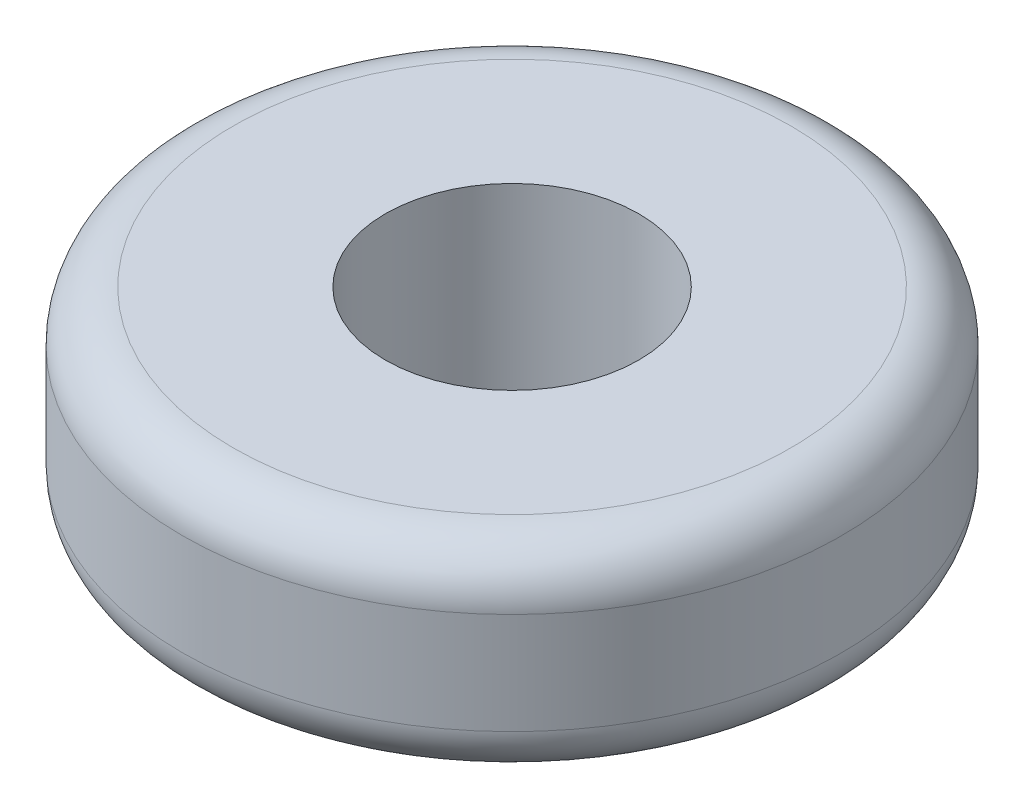
ISO-10303-21;
HEADER;
FILE_DESCRIPTION(('STEP AP214'),'2;1');
FILE_NAME('part.step','',(''),(''),'','','');
FILE_SCHEMA(('AUTOMOTIVE_DESIGN { 1 0 10303 214 1 1 1 1 }'));
ENDSEC;
DATA;
#1=APPLICATION_CONTEXT('core data for automotive mechanical design processes');
#2=APPLICATION_PROTOCOL_DEFINITION('international standard','automotive_design',2000,#1);
#3=PRODUCT_CONTEXT('',#1,'mechanical');
#4=PRODUCT('Part','Part','',(#3));
#5=PRODUCT_RELATED_PRODUCT_CATEGORY('part','',(#4));
#6=PRODUCT_DEFINITION_FORMATION('','',#4);
#7=PRODUCT_DEFINITION_CONTEXT('part definition',#1,'design');
#8=PRODUCT_DEFINITION('design','',#6,#7);
#9=PRODUCT_DEFINITION_SHAPE('','',#8);
#10=(LENGTH_UNIT() NAMED_UNIT(*) SI_UNIT(.MILLI.,.METRE.));
#11=(NAMED_UNIT(*) PLANE_ANGLE_UNIT() SI_UNIT($,.RADIAN.));
#12=(NAMED_UNIT(*) SI_UNIT($,.STERADIAN.) SOLID_ANGLE_UNIT());
#13=UNCERTAINTY_MEASURE_WITH_UNIT(LENGTH_MEASURE(1.E-05),#10,'distance_accuracy_value','');
#14=(GEOMETRIC_REPRESENTATION_CONTEXT(3) GLOBAL_UNCERTAINTY_ASSIGNED_CONTEXT((#13)) GLOBAL_UNIT_ASSIGNED_CONTEXT((#10,
#11,#12)) REPRESENTATION_CONTEXT('',''));
#15=CARTESIAN_POINT('',(0.,0.,0.));
#16=DIRECTION('',(0.,0.,1.));
#17=DIRECTION('',(1.,0.,0.));
#18=AXIS2_PLACEMENT_3D('',#15,#16,#17);
#19=CARTESIAN_POINT('',(0.,8.,0.));
#20=DIRECTION('',(0.,1.,0.));
#21=DIRECTION('',(0.,0.,1.));
#22=AXIS2_PLACEMENT_3D('',#19,#20,#21);
#23=PLANE('',#22);
#24=CARTESIAN_POINT('',(0.,8.,0.));
#25=DIRECTION('',(0.,1.,0.));
#26=DIRECTION('',(0.,0.,1.));
#27=AXIS2_PLACEMENT_3D('',#24,#25,#26);
#28=CIRCLE('',#27,11.);
#29=CARTESIAN_POINT('',(0.,8.,11.));
#30=VERTEX_POINT('',#29);
#31=EDGE_CURVE('E10',#30,#30,#28,.T.);
#32=ORIENTED_EDGE('',*,*,#31,.T.);
#33=EDGE_LOOP('',(#32));
#34=FACE_BOUND('',#33,.T.);
#35=CARTESIAN_POINT('',(0.,8.,0.));
#36=DIRECTION('',(0.,1.,0.));
#37=DIRECTION('',(0.,0.,1.));
#38=AXIS2_PLACEMENT_3D('',#35,#36,#37);
#39=CIRCLE('',#38,5.);
#40=CARTESIAN_POINT('',(0.,8.,5.));
#41=VERTEX_POINT('',#40);
#42=EDGE_CURVE('E55',#41,#41,#39,.T.);
#43=ORIENTED_EDGE('',*,*,#42,.F.);
#44=EDGE_LOOP('',(#43));
#45=FACE_BOUND('',#44,.T.);
#46=ADVANCED_FACE('F35',(#34,#45),#23,.T.);
#47=CARTESIAN_POINT('',(0.,0.,0.));
#48=DIRECTION('',(0.,1.,0.));
#49=DIRECTION('',(0.,0.,1.));
#50=AXIS2_PLACEMENT_3D('',#47,#48,#49);
#51=PLANE('',#50);
#52=CARTESIAN_POINT('',(0.,0.,0.));
#53=DIRECTION('',(0.,1.,0.));
#54=DIRECTION('',(0.,0.,1.));
#55=AXIS2_PLACEMENT_3D('',#52,#53,#54);
#56=CIRCLE('',#55,11.);
#57=CARTESIAN_POINT('',(0.,0.,11.));
#58=VERTEX_POINT('',#57);
#59=EDGE_CURVE('E42',#58,#58,#56,.F.);
#60=ORIENTED_EDGE('',*,*,#59,.T.);
#61=EDGE_LOOP('',(#60));
#62=FACE_BOUND('',#61,.T.);
#63=CARTESIAN_POINT('',(0.,0.,0.));
#64=DIRECTION('',(0.,1.,0.));
#65=DIRECTION('',(0.,0.,1.));
#66=AXIS2_PLACEMENT_3D('',#63,#64,#65);
#67=CIRCLE('',#66,5.);
#68=CARTESIAN_POINT('',(0.,0.,5.));
#69=VERTEX_POINT('',#68);
#70=EDGE_CURVE('E56',#69,#69,#67,.T.);
#71=ORIENTED_EDGE('',*,*,#70,.T.);
#72=EDGE_LOOP('',(#71));
#73=FACE_BOUND('',#72,.T.);
#74=ADVANCED_FACE('F66',(#62,#73),#51,.F.);
#75=CARTESIAN_POINT('',(0.,8.,0.));
#76=DIRECTION('',(0.,-1.,0.));
#77=DIRECTION('',(0.,0.,-1.));
#78=AXIS2_PLACEMENT_3D('',#75,#76,#77);
#79=CYLINDRICAL_SURFACE('',#78,13.);
#80=CARTESIAN_POINT('',(0.,2.,0.));
#81=DIRECTION('',(0.,1.,0.));
#82=DIRECTION('',(0.,0.,1.));
#83=AXIS2_PLACEMENT_3D('',#80,#81,#82);
#84=CIRCLE('',#83,13.);
#85=CARTESIAN_POINT('',(0.,2.,13.));
#86=VERTEX_POINT('',#85);
#87=EDGE_CURVE('E46',#86,#86,#84,.T.);
#88=ORIENTED_EDGE('',*,*,#87,.T.);
#89=EDGE_LOOP('',(#88));
#90=FACE_BOUND('',#89,.T.);
#91=CARTESIAN_POINT('',(0.,6.,0.));
#92=DIRECTION('',(0.,1.,0.));
#93=DIRECTION('',(0.,0.,1.));
#94=AXIS2_PLACEMENT_3D('',#91,#92,#93);
#95=CIRCLE('',#94,13.);
#96=CARTESIAN_POINT('',(0.,6.,13.));
#97=VERTEX_POINT('',#96);
#98=EDGE_CURVE('E50',#97,#97,#95,.F.);
#99=ORIENTED_EDGE('',*,*,#98,.T.);
#100=EDGE_LOOP('',(#99));
#101=FACE_BOUND('',#100,.T.);
#102=ADVANCED_FACE('F71',(#90,#101),#79,.T.);
#103=CARTESIAN_POINT('',(0.,8.,0.));
#104=DIRECTION('',(0.,-1.,0.));
#105=DIRECTION('',(0.,0.,-1.));
#106=AXIS2_PLACEMENT_3D('',#103,#104,#105);
#107=CYLINDRICAL_SURFACE('',#106,5.);
#108=ORIENTED_EDGE('',*,*,#42,.T.);
#109=EDGE_LOOP('',(#108));
#110=FACE_BOUND('',#109,.T.);
#111=ORIENTED_EDGE('',*,*,#70,.F.);
#112=EDGE_LOOP('',(#111));
#113=FACE_BOUND('',#112,.T.);
#114=ADVANCED_FACE('F62',(#110,#113),#107,.F.);
#115=CARTESIAN_POINT('',(0.,2.,0.));
#116=DIRECTION('',(0.,1.,0.));
#117=DIRECTION('',(0.,0.,1.));
#118=AXIS2_PLACEMENT_3D('',#115,#116,#117);
#119=TOROIDAL_SURFACE('',#118,11.,2.);
#120=ORIENTED_EDGE('',*,*,#59,.F.);
#121=EDGE_LOOP('',(#120));
#122=FACE_BOUND('',#121,.T.);
#123=ORIENTED_EDGE('',*,*,#87,.F.);
#124=EDGE_LOOP('',(#123));
#125=FACE_BOUND('',#124,.T.);
#126=ADVANCED_FACE('F77',(#122,#125),#119,.T.);
#127=CARTESIAN_POINT('',(0.,6.,0.));
#128=DIRECTION('',(0.,1.,0.));
#129=DIRECTION('',(0.,0.,1.));
#130=AXIS2_PLACEMENT_3D('',#127,#128,#129);
#131=TOROIDAL_SURFACE('',#130,11.,2.);
#132=ORIENTED_EDGE('',*,*,#98,.F.);
#133=EDGE_LOOP('',(#132));
#134=FACE_BOUND('',#133,.T.);
#135=ORIENTED_EDGE('',*,*,#31,.F.);
#136=EDGE_LOOP('',(#135));
#137=FACE_BOUND('',#136,.T.);
#138=ADVANCED_FACE('F37',(#134,#137),#131,.T.);
#139=CLOSED_SHELL('',(#46,#74,#102,#114,#126,#138));
#140=MANIFOLD_SOLID_BREP('B2',#139);
#141=ADVANCED_BREP_SHAPE_REPRESENTATION('',(#18,#140),#14);
#142=SHAPE_DEFINITION_REPRESENTATION(#9,#141);
ENDSEC;
END-ISO-10303-21;
